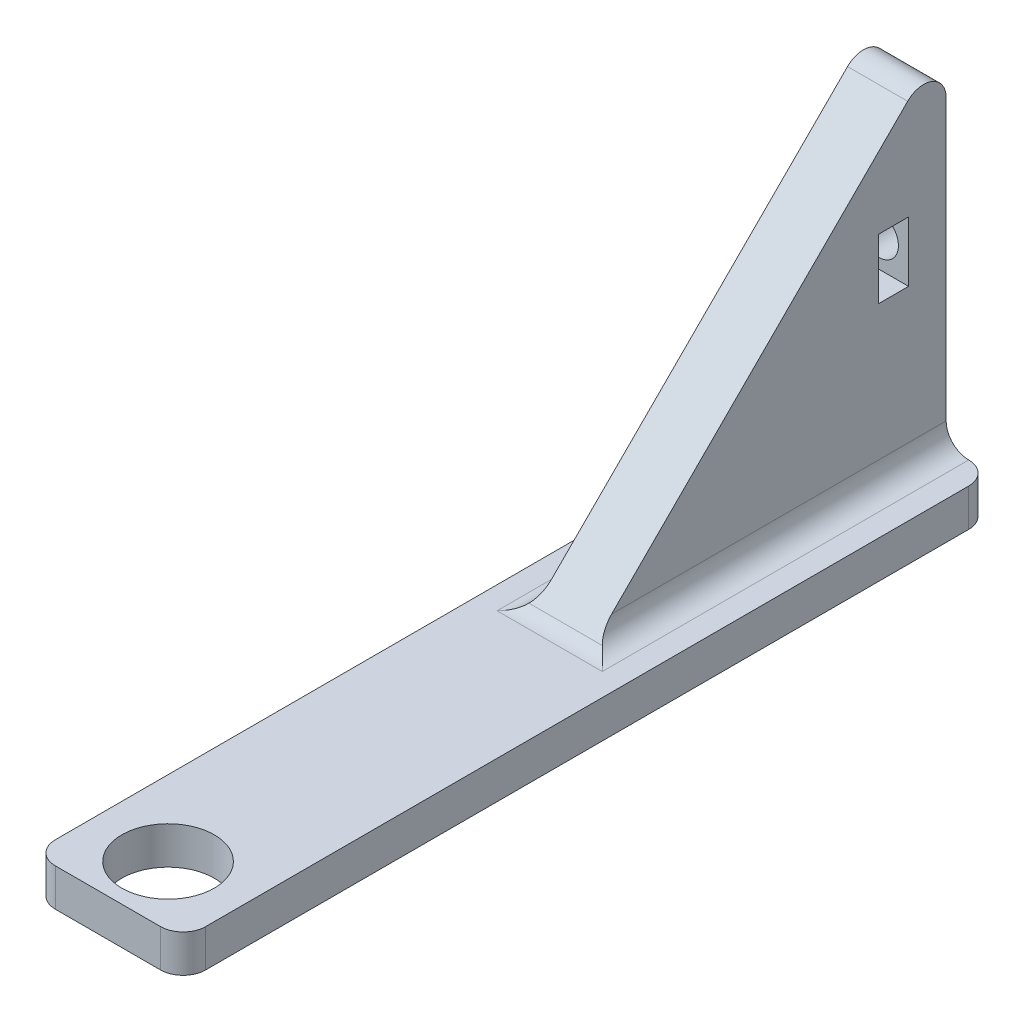
ISO-10303-21;
HEADER;
FILE_DESCRIPTION(('STEP AP214'),'2;1');
FILE_NAME('part.step','',(''),(''),'','','');
FILE_SCHEMA(('AUTOMOTIVE_DESIGN { 1 0 10303 214 1 1 1 1 }'));
ENDSEC;
DATA;
#1=APPLICATION_CONTEXT('core data for automotive mechanical design processes');
#2=APPLICATION_PROTOCOL_DEFINITION('international standard','automotive_design',2000,#1);
#3=PRODUCT_CONTEXT('',#1,'mechanical');
#4=PRODUCT('Part','Part','',(#3));
#5=PRODUCT_RELATED_PRODUCT_CATEGORY('part','',(#4));
#6=PRODUCT_DEFINITION_FORMATION('','',#4);
#7=PRODUCT_DEFINITION_CONTEXT('part definition',#1,'design');
#8=PRODUCT_DEFINITION('design','',#6,#7);
#9=PRODUCT_DEFINITION_SHAPE('','',#8);
#10=(LENGTH_UNIT() NAMED_UNIT(*) SI_UNIT(.MILLI.,.METRE.));
#11=(NAMED_UNIT(*) PLANE_ANGLE_UNIT() SI_UNIT($,.RADIAN.));
#12=(NAMED_UNIT(*) SI_UNIT($,.STERADIAN.) SOLID_ANGLE_UNIT());
#13=UNCERTAINTY_MEASURE_WITH_UNIT(LENGTH_MEASURE(1.E-05),#10,'distance_accuracy_value','');
#14=(GEOMETRIC_REPRESENTATION_CONTEXT(3) GLOBAL_UNCERTAINTY_ASSIGNED_CONTEXT((#13)) GLOBAL_UNIT_ASSIGNED_CONTEXT((#10,
#11,#12)) REPRESENTATION_CONTEXT('',''));
#15=CARTESIAN_POINT('',(0.,0.,0.));
#16=DIRECTION('',(0.,0.,1.));
#17=DIRECTION('',(1.,0.,0.));
#18=AXIS2_PLACEMENT_3D('',#15,#16,#17);
#19=CARTESIAN_POINT('',(0.,5.,0.));
#20=DIRECTION('',(0.,1.,0.));
#21=DIRECTION('',(0.,0.,1.));
#22=AXIS2_PLACEMENT_3D('',#19,#20,#21);
#23=PLANE('',#22);
#24=DIRECTION('',(1.,0.,0.));
#25=VECTOR('',#24,1.);
#26=CARTESIAN_POINT('',(0.,5.,107.5));
#27=LINE('',#26,#25);
#28=CARTESIAN_POINT('',(3.,5.,107.5));
#29=VERTEX_POINT('',#28);
#30=CARTESIAN_POINT('',(17.,5.,107.5));
#31=VERTEX_POINT('',#30);
#32=EDGE_CURVE('E238',#29,#31,#27,.T.);
#33=ORIENTED_EDGE('',*,*,#32,.T.);
#34=CARTESIAN_POINT('',(17.,5.,104.5));
#35=DIRECTION('',(0.,1.,0.));
#36=DIRECTION('',(0.,0.,1.));
#37=AXIS2_PLACEMENT_3D('',#34,#35,#36);
#38=CIRCLE('',#37,3.);
#39=CARTESIAN_POINT('',(20.,5.,104.5));
#40=VERTEX_POINT('',#39);
#41=EDGE_CURVE('E306',#31,#40,#38,.T.);
#42=ORIENTED_EDGE('',*,*,#41,.T.);
#43=DIRECTION('',(0.,0.,-1.));
#44=VECTOR('',#43,1.);
#45=CARTESIAN_POINT('',(20.,5.,0.));
#46=LINE('',#45,#44);
#47=CARTESIAN_POINT('',(20.,5.,3.));
#48=VERTEX_POINT('',#47);
#49=EDGE_CURVE('E245',#40,#48,#46,.T.);
#50=ORIENTED_EDGE('',*,*,#49,.T.);
#51=CARTESIAN_POINT('',(17.,5.,3.));
#52=DIRECTION('',(0.,1.,0.));
#53=DIRECTION('',(0.,0.,1.));
#54=AXIS2_PLACEMENT_3D('',#51,#52,#53);
#55=CIRCLE('',#54,3.);
#56=CARTESIAN_POINT('',(17.,5.,0.));
#57=VERTEX_POINT('',#56);
#58=EDGE_CURVE('E301',#48,#57,#55,.T.);
#59=ORIENTED_EDGE('',*,*,#58,.T.);
#60=DIRECTION('',(0.,0.,-1.));
#61=VECTOR('',#60,1.);
#62=CARTESIAN_POINT('',(17.,5.,47.5));
#63=LINE('',#62,#61);
#64=CARTESIAN_POINT('',(17.,5.,48.7426406871193));
#65=VERTEX_POINT('',#64);
#66=EDGE_CURVE('E292',#57,#65,#63,.F.);
#67=ORIENTED_EDGE('',*,*,#66,.T.);
#68=DIRECTION('',(1.,0.,0.));
#69=VECTOR('',#68,1.);
#70=CARTESIAN_POINT('',(6.,5.,48.7426406871193));
#71=LINE('',#70,#69);
#72=CARTESIAN_POINT('',(3.,5.,48.7426406871193));
#73=VERTEX_POINT('',#72);
#74=EDGE_CURVE('E295',#65,#73,#71,.F.);
#75=ORIENTED_EDGE('',*,*,#74,.T.);
#76=DIRECTION('',(0.,0.,-1.));
#77=VECTOR('',#76,1.);
#78=CARTESIAN_POINT('',(3.,5.,0.));
#79=LINE('',#78,#77);
#80=CARTESIAN_POINT('',(3.,5.,0.));
#81=VERTEX_POINT('',#80);
#82=EDGE_CURVE('E298',#73,#81,#79,.T.);
#83=ORIENTED_EDGE('',*,*,#82,.T.);
#84=CARTESIAN_POINT('',(3.,5.,3.));
#85=DIRECTION('',(0.,1.,0.));
#86=DIRECTION('',(0.,0.,1.));
#87=AXIS2_PLACEMENT_3D('',#84,#85,#86);
#88=CIRCLE('',#87,3.);
#89=CARTESIAN_POINT('',(0.,5.,3.));
#90=VERTEX_POINT('',#89);
#91=EDGE_CURVE('E299',#81,#90,#88,.T.);
#92=ORIENTED_EDGE('',*,*,#91,.T.);
#93=DIRECTION('',(0.,0.,1.));
#94=VECTOR('',#93,1.);
#95=CARTESIAN_POINT('',(0.,5.,0.));
#96=LINE('',#95,#94);
#97=CARTESIAN_POINT('',(0.,5.,104.5));
#98=VERTEX_POINT('',#97);
#99=EDGE_CURVE('E232',#90,#98,#96,.T.);
#100=ORIENTED_EDGE('',*,*,#99,.T.);
#101=CARTESIAN_POINT('',(3.,5.,104.5));
#102=DIRECTION('',(0.,1.,0.));
#103=DIRECTION('',(0.,0.,1.));
#104=AXIS2_PLACEMENT_3D('',#101,#102,#103);
#105=CIRCLE('',#104,3.);
#106=EDGE_CURVE('E302',#98,#29,#105,.T.);
#107=ORIENTED_EDGE('',*,*,#106,.T.);
#108=EDGE_LOOP('',(#33,#42,#50,#59,#67,#75,#83,#92,#100,#107));
#109=FACE_BOUND('',#108,.T.);
#110=CARTESIAN_POINT('',(10.,5.,99.5));
#111=DIRECTION('',(0.,1.,0.));
#112=DIRECTION('',(0.,0.,1.));
#113=AXIS2_PLACEMENT_3D('',#110,#111,#112);
#114=CIRCLE('',#113,6.15000000000001);
#115=CARTESIAN_POINT('',(10.,5.,105.65));
#116=VERTEX_POINT('',#115);
#117=EDGE_CURVE('E230',#116,#116,#114,.T.);
#118=ORIENTED_EDGE('',*,*,#117,.F.);
#119=EDGE_LOOP('',(#118));
#120=FACE_BOUND('',#119,.T.);
#121=ADVANCED_FACE('F39',(#109,#120),#23,.T.);
#122=CARTESIAN_POINT('',(0.,0.,0.));
#123=DIRECTION('',(0.,1.,0.));
#124=DIRECTION('',(0.,0.,1.));
#125=AXIS2_PLACEMENT_3D('',#122,#123,#124);
#126=PLANE('',#125);
#127=DIRECTION('',(-1.,0.,0.));
#128=VECTOR('',#127,1.);
#129=CARTESIAN_POINT('',(0.,0.,0.));
#130=LINE('',#129,#128);
#131=CARTESIAN_POINT('',(17.,0.,0.));
#132=VERTEX_POINT('',#131);
#133=CARTESIAN_POINT('',(3.,0.,0.));
#134=VERTEX_POINT('',#133);
#135=EDGE_CURVE('E237',#132,#134,#130,.T.);
#136=ORIENTED_EDGE('',*,*,#135,.F.);
#137=CARTESIAN_POINT('',(17.,0.,3.));
#138=DIRECTION('',(0.,1.,0.));
#139=DIRECTION('',(0.,0.,1.));
#140=AXIS2_PLACEMENT_3D('',#137,#138,#139);
#141=CIRCLE('',#140,3.);
#142=CARTESIAN_POINT('',(20.,0.,3.));
#143=VERTEX_POINT('',#142);
#144=EDGE_CURVE('E284',#132,#143,#141,.F.);
#145=ORIENTED_EDGE('',*,*,#144,.T.);
#146=DIRECTION('',(0.,0.,-1.));
#147=VECTOR('',#146,1.);
#148=CARTESIAN_POINT('',(20.,0.,0.));
#149=LINE('',#148,#147);
#150=CARTESIAN_POINT('',(20.,0.,104.5));
#151=VERTEX_POINT('',#150);
#152=EDGE_CURVE('E252',#151,#143,#149,.T.);
#153=ORIENTED_EDGE('',*,*,#152,.F.);
#154=CARTESIAN_POINT('',(17.,0.,104.5));
#155=DIRECTION('',(0.,1.,0.));
#156=DIRECTION('',(0.,0.,1.));
#157=AXIS2_PLACEMENT_3D('',#154,#155,#156);
#158=CIRCLE('',#157,3.);
#159=CARTESIAN_POINT('',(17.,0.,107.5));
#160=VERTEX_POINT('',#159);
#161=EDGE_CURVE('E281',#151,#160,#158,.F.);
#162=ORIENTED_EDGE('',*,*,#161,.T.);
#163=DIRECTION('',(1.,0.,0.));
#164=VECTOR('',#163,1.);
#165=CARTESIAN_POINT('',(0.,0.,107.5));
#166=LINE('',#165,#164);
#167=CARTESIAN_POINT('',(3.,0.,107.5));
#168=VERTEX_POINT('',#167);
#169=EDGE_CURVE('E247',#168,#160,#166,.T.);
#170=ORIENTED_EDGE('',*,*,#169,.F.);
#171=CARTESIAN_POINT('',(3.,0.,104.5));
#172=DIRECTION('',(0.,1.,0.));
#173=DIRECTION('',(0.,0.,1.));
#174=AXIS2_PLACEMENT_3D('',#171,#172,#173);
#175=CIRCLE('',#174,3.);
#176=CARTESIAN_POINT('',(0.,0.,104.5));
#177=VERTEX_POINT('',#176);
#178=EDGE_CURVE('E276',#168,#177,#175,.F.);
#179=ORIENTED_EDGE('',*,*,#178,.T.);
#180=DIRECTION('',(0.,0.,1.));
#181=VECTOR('',#180,1.);
#182=CARTESIAN_POINT('',(0.,0.,0.));
#183=LINE('',#182,#181);
#184=CARTESIAN_POINT('',(0.,0.,3.));
#185=VERTEX_POINT('',#184);
#186=EDGE_CURVE('E235',#185,#177,#183,.T.);
#187=ORIENTED_EDGE('',*,*,#186,.F.);
#188=CARTESIAN_POINT('',(3.,0.,3.));
#189=DIRECTION('',(0.,1.,0.));
#190=DIRECTION('',(0.,0.,1.));
#191=AXIS2_PLACEMENT_3D('',#188,#189,#190);
#192=CIRCLE('',#191,3.);
#193=EDGE_CURVE('E282',#185,#134,#192,.F.);
#194=ORIENTED_EDGE('',*,*,#193,.T.);
#195=EDGE_LOOP('',(#136,#145,#153,#162,#170,#179,#187,#194));
#196=FACE_BOUND('',#195,.T.);
#197=CARTESIAN_POINT('',(10.,0.,99.5));
#198=DIRECTION('',(0.,1.,0.));
#199=DIRECTION('',(0.,0.,1.));
#200=AXIS2_PLACEMENT_3D('',#197,#198,#199);
#201=CIRCLE('',#200,6.15000000000001);
#202=CARTESIAN_POINT('',(10.,0.,105.65));
#203=VERTEX_POINT('',#202);
#204=EDGE_CURVE('E226',#203,#203,#201,.T.);
#205=ORIENTED_EDGE('',*,*,#204,.T.);
#206=EDGE_LOOP('',(#205));
#207=FACE_BOUND('',#206,.T.);
#208=ADVANCED_FACE('F370',(#196,#207),#126,.F.);
#209=CARTESIAN_POINT('',(0.,5.,0.));
#210=DIRECTION('',(1.,0.,0.));
#211=DIRECTION('',(0.,0.,-1.));
#212=AXIS2_PLACEMENT_3D('',#209,#210,#211);
#213=PLANE('',#212);
#214=ORIENTED_EDGE('',*,*,#99,.F.);
#215=DIRECTION('',(0.,-1.,0.));
#216=VECTOR('',#215,1.);
#217=CARTESIAN_POINT('',(0.,5.,3.));
#218=LINE('',#217,#216);
#219=EDGE_CURVE('E309',#90,#185,#218,.T.);
#220=ORIENTED_EDGE('',*,*,#219,.T.);
#221=ORIENTED_EDGE('',*,*,#186,.T.);
#222=DIRECTION('',(0.,-1.,0.));
#223=VECTOR('',#222,1.);
#224=CARTESIAN_POINT('',(0.,5.,104.5));
#225=LINE('',#224,#223);
#226=EDGE_CURVE('E308',#177,#98,#225,.F.);
#227=ORIENTED_EDGE('',*,*,#226,.T.);
#228=EDGE_LOOP('',(#214,#220,#221,#227));
#229=FACE_BOUND('',#228,.T.);
#230=ADVANCED_FACE('F389',(#229),#213,.F.);
#231=CARTESIAN_POINT('',(0.,5.,107.5));
#232=DIRECTION('',(0.,0.,-1.));
#233=DIRECTION('',(-1.,0.,0.));
#234=AXIS2_PLACEMENT_3D('',#231,#232,#233);
#235=PLANE('',#234);
#236=ORIENTED_EDGE('',*,*,#169,.T.);
#237=DIRECTION('',(0.,-1.,0.));
#238=VECTOR('',#237,1.);
#239=CARTESIAN_POINT('',(17.,5.,107.5));
#240=LINE('',#239,#238);
#241=EDGE_CURVE('E317',#160,#31,#240,.F.);
#242=ORIENTED_EDGE('',*,*,#241,.T.);
#243=ORIENTED_EDGE('',*,*,#32,.F.);
#244=DIRECTION('',(0.,-1.,0.));
#245=VECTOR('',#244,1.);
#246=CARTESIAN_POINT('',(3.,5.,107.5));
#247=LINE('',#246,#245);
#248=EDGE_CURVE('E312',#29,#168,#247,.T.);
#249=ORIENTED_EDGE('',*,*,#248,.T.);
#250=EDGE_LOOP('',(#236,#242,#243,#249));
#251=FACE_BOUND('',#250,.T.);
#252=ADVANCED_FACE('F377',(#251),#235,.F.);
#253=CARTESIAN_POINT('',(20.,5.,0.));
#254=DIRECTION('',(-1.,0.,0.));
#255=DIRECTION('',(0.,0.,1.));
#256=AXIS2_PLACEMENT_3D('',#253,#254,#255);
#257=PLANE('',#256);
#258=ORIENTED_EDGE('',*,*,#152,.T.);
#259=DIRECTION('',(0.,-1.,0.));
#260=VECTOR('',#259,1.);
#261=CARTESIAN_POINT('',(20.,5.,3.));
#262=LINE('',#261,#260);
#263=EDGE_CURVE('E290',#143,#48,#262,.F.);
#264=ORIENTED_EDGE('',*,*,#263,.T.);
#265=ORIENTED_EDGE('',*,*,#49,.F.);
#266=DIRECTION('',(0.,-1.,0.));
#267=VECTOR('',#266,1.);
#268=CARTESIAN_POINT('',(20.,5.,104.5));
#269=LINE('',#268,#267);
#270=EDGE_CURVE('E287',#40,#151,#269,.T.);
#271=ORIENTED_EDGE('',*,*,#270,.T.);
#272=EDGE_LOOP('',(#258,#264,#265,#271));
#273=FACE_BOUND('',#272,.T.);
#274=ADVANCED_FACE('F369',(#273),#257,.F.);
#275=CARTESIAN_POINT('',(0.,5.,0.));
#276=DIRECTION('',(0.,0.,1.));
#277=DIRECTION('',(1.,0.,0.));
#278=AXIS2_PLACEMENT_3D('',#275,#276,#277);
#279=PLANE('',#278);
#280=CARTESIAN_POINT('',(10.,30.,0.));
#281=DIRECTION('',(0.,0.,-1.));
#282=DIRECTION('',(-1.,0.,0.));
#283=AXIS2_PLACEMENT_3D('',#280,#281,#282);
#284=CIRCLE('',#283,2.65);
#285=CARTESIAN_POINT('',(7.35,30.,0.));
#286=VERTEX_POINT('',#285);
#287=EDGE_CURVE('E208',#286,#286,#284,.T.);
#288=ORIENTED_EDGE('',*,*,#287,.F.);
#289=EDGE_LOOP('',(#288));
#290=FACE_BOUND('',#289,.T.);
#291=DIRECTION('',(0.,1.,0.));
#292=VECTOR('',#291,1.);
#293=CARTESIAN_POINT('',(6.,5.,0.));
#294=LINE('',#293,#292);
#295=CARTESIAN_POINT('',(6.,8.,0.));
#296=VERTEX_POINT('',#295);
#297=CARTESIAN_POINT('',(6.,45.2573593128807,0.));
#298=VERTEX_POINT('',#297);
#299=EDGE_CURVE('E222',#296,#298,#294,.T.);
#300=ORIENTED_EDGE('',*,*,#299,.T.);
#301=DIRECTION('',(1.,0.,0.));
#302=VECTOR('',#301,1.);
#303=CARTESIAN_POINT('',(14.,45.2573593128807,0.));
#304=LINE('',#303,#302);
#305=CARTESIAN_POINT('',(14.,45.2573593128807,0.));
#306=VERTEX_POINT('',#305);
#307=EDGE_CURVE('E264',#298,#306,#304,.T.);
#308=ORIENTED_EDGE('',*,*,#307,.T.);
#309=DIRECTION('',(0.,1.,0.));
#310=VECTOR('',#309,1.);
#311=CARTESIAN_POINT('',(14.,5.,0.));
#312=LINE('',#311,#310);
#313=CARTESIAN_POINT('',(14.,8.,0.));
#314=VERTEX_POINT('',#313);
#315=EDGE_CURVE('E211',#314,#306,#312,.T.);
#316=ORIENTED_EDGE('',*,*,#315,.F.);
#317=CARTESIAN_POINT('',(17.,8.,0.));
#318=DIRECTION('',(0.,0.,1.));
#319=DIRECTION('',(1.,0.,0.));
#320=AXIS2_PLACEMENT_3D('',#317,#318,#319);
#321=CIRCLE('',#320,3.);
#322=EDGE_CURVE('E48',#314,#57,#321,.T.);
#323=ORIENTED_EDGE('',*,*,#322,.T.);
#324=DIRECTION('',(0.,-1.,0.));
#325=VECTOR('',#324,1.);
#326=CARTESIAN_POINT('',(17.,5.,0.));
#327=LINE('',#326,#325);
#328=EDGE_CURVE('E265',#57,#132,#327,.T.);
#329=ORIENTED_EDGE('',*,*,#328,.T.);
#330=ORIENTED_EDGE('',*,*,#135,.T.);
#331=DIRECTION('',(0.,-1.,0.));
#332=VECTOR('',#331,1.);
#333=CARTESIAN_POINT('',(3.,5.,0.));
#334=LINE('',#333,#332);
#335=EDGE_CURVE('E244',#134,#81,#334,.F.);
#336=ORIENTED_EDGE('',*,*,#335,.T.);
#337=CARTESIAN_POINT('',(3.,8.,0.));
#338=DIRECTION('',(0.,0.,1.));
#339=DIRECTION('',(1.,0.,0.));
#340=AXIS2_PLACEMENT_3D('',#337,#338,#339);
#341=CIRCLE('',#340,3.);
#342=EDGE_CURVE('E319',#81,#296,#341,.T.);
#343=ORIENTED_EDGE('',*,*,#342,.T.);
#344=EDGE_LOOP('',(#300,#308,#316,#323,#329,#330,#336,#343));
#345=FACE_BOUND('',#344,.T.);
#346=ADVANCED_FACE('F349',(#290,#345),#279,.F.);
#347=CARTESIAN_POINT('',(10.,5.,99.5));
#348=DIRECTION('',(0.,-1.,0.));
#349=DIRECTION('',(0.,0.,-1.));
#350=AXIS2_PLACEMENT_3D('',#347,#348,#349);
#351=CYLINDRICAL_SURFACE('',#350,6.15000000000001);
#352=ORIENTED_EDGE('',*,*,#117,.T.);
#353=EDGE_LOOP('',(#352));
#354=FACE_BOUND('',#353,.T.);
#355=ORIENTED_EDGE('',*,*,#204,.F.);
#356=EDGE_LOOP('',(#355));
#357=FACE_BOUND('',#356,.T.);
#358=ADVANCED_FACE('F396',(#354,#357),#351,.F.);
#359=CARTESIAN_POINT('',(6.,52.5,0.));
#360=DIRECTION('',(0.,0.707106781186547,0.707106781186547));
#361=DIRECTION('',(0.,-0.707106781186548,0.707106781186548));
#362=AXIS2_PLACEMENT_3D('',#359,#360,#361);
#363=PLANE('',#362);
#364=DIRECTION('',(0.,-0.707106781186548,0.707106781186548));
#365=VECTOR('',#364,1.);
#366=CARTESIAN_POINT('',(14.,52.5,0.));
#367=LINE('',#366,#365);
#368=CARTESIAN_POINT('',(14.,47.3786796564404,5.12132034355965));
#369=VERTEX_POINT('',#368);
#370=CARTESIAN_POINT('',(14.,7.99999999999999,44.5));
#371=VERTEX_POINT('',#370);
#372=EDGE_CURVE('E218',#369,#371,#367,.T.);
#373=ORIENTED_EDGE('',*,*,#372,.F.);
#374=DIRECTION('',(1.,0.,0.));
#375=VECTOR('',#374,1.);
#376=CARTESIAN_POINT('',(6.,47.3786796564404,5.12132034355964));
#377=LINE('',#376,#375);
#378=CARTESIAN_POINT('',(6.,47.3786796564404,5.12132034355965));
#379=VERTEX_POINT('',#378);
#380=EDGE_CURVE('E271',#369,#379,#377,.F.);
#381=ORIENTED_EDGE('',*,*,#380,.T.);
#382=DIRECTION('',(0.,-0.707106781186548,0.707106781186548));
#383=VECTOR('',#382,1.);
#384=CARTESIAN_POINT('',(6.,52.5,0.));
#385=LINE('',#384,#383);
#386=CARTESIAN_POINT('',(6.,7.99999999999999,44.5));
#387=VERTEX_POINT('',#386);
#388=EDGE_CURVE('E225',#379,#387,#385,.T.);
#389=ORIENTED_EDGE('',*,*,#388,.T.);
#390=CARTESIAN_POINT('',(3.,8.,44.5));
#391=DIRECTION('',(0.,0.707106781186547,0.707106781186547));
#392=DIRECTION('',(0.,0.707106781186548,-0.707106781186548));
#393=AXIS2_PLACEMENT_3D('',#390,#391,#392);
#394=ELLIPSE('',#393,4.24264068711929,3.);
#395=CARTESIAN_POINT('',(5.12132034355964,5.87867965644036,46.6213203435596));
#396=VERTEX_POINT('',#395);
#397=EDGE_CURVE('E318',#387,#396,#394,.F.);
#398=ORIENTED_EDGE('',*,*,#397,.T.);
#399=DIRECTION('',(1.,0.,0.));
#400=VECTOR('',#399,1.);
#401=CARTESIAN_POINT('',(14.,5.87867965644036,46.6213203435596));
#402=LINE('',#401,#400);
#403=CARTESIAN_POINT('',(14.8786796564404,5.87867965644036,46.6213203435596));
#404=VERTEX_POINT('',#403);
#405=EDGE_CURVE('E54',#396,#404,#402,.T.);
#406=ORIENTED_EDGE('',*,*,#405,.T.);
#407=CARTESIAN_POINT('',(17.,8.,44.5));
#408=DIRECTION('',(0.,0.707106781186547,0.707106781186547));
#409=DIRECTION('',(0.,-0.707106781186548,0.707106781186548));
#410=AXIS2_PLACEMENT_3D('',#407,#408,#409);
#411=ELLIPSE('',#410,4.24264068711929,3.);
#412=EDGE_CURVE('E11',#404,#371,#411,.F.);
#413=ORIENTED_EDGE('',*,*,#412,.T.);
#414=EDGE_LOOP('',(#373,#381,#389,#398,#406,#413));
#415=FACE_BOUND('',#414,.T.);
#416=ADVANCED_FACE('F336',(#415),#363,.T.);
#417=CARTESIAN_POINT('',(6.,0.,0.));
#418=DIRECTION('',(1.,0.,0.));
#419=DIRECTION('',(0.,0.,-1.));
#420=AXIS2_PLACEMENT_3D('',#417,#418,#419);
#421=PLANE('',#420);
#422=DIRECTION('',(0.,0.,1.));
#423=VECTOR('',#422,1.);
#424=CARTESIAN_POINT('',(6.,34.,0.));
#425=LINE('',#424,#423);
#426=CARTESIAN_POINT('',(6.,34.,5.));
#427=VERTEX_POINT('',#426);
#428=CARTESIAN_POINT('',(6.,34.,9.));
#429=VERTEX_POINT('',#428);
#430=EDGE_CURVE('E210',#427,#429,#425,.T.);
#431=ORIENTED_EDGE('',*,*,#430,.T.);
#432=DIRECTION('',(0.,-1.,0.));
#433=VECTOR('',#432,1.);
#434=CARTESIAN_POINT('',(6.,0.,9.));
#435=LINE('',#434,#433);
#436=CARTESIAN_POINT('',(6.,26.,9.));
#437=VERTEX_POINT('',#436);
#438=EDGE_CURVE('E202',#429,#437,#435,.T.);
#439=ORIENTED_EDGE('',*,*,#438,.T.);
#440=DIRECTION('',(0.,0.,-1.));
#441=VECTOR('',#440,1.);
#442=CARTESIAN_POINT('',(6.,26.,0.));
#443=LINE('',#442,#441);
#444=CARTESIAN_POINT('',(6.,26.,5.));
#445=VERTEX_POINT('',#444);
#446=EDGE_CURVE('E205',#437,#445,#443,.T.);
#447=ORIENTED_EDGE('',*,*,#446,.T.);
#448=DIRECTION('',(0.,1.,0.));
#449=VECTOR('',#448,1.);
#450=CARTESIAN_POINT('',(6.,0.,5.));
#451=LINE('',#450,#449);
#452=EDGE_CURVE('E175',#445,#427,#451,.T.);
#453=ORIENTED_EDGE('',*,*,#452,.T.);
#454=EDGE_LOOP('',(#431,#439,#447,#453));
#455=FACE_BOUND('',#454,.T.);
#456=ORIENTED_EDGE('',*,*,#388,.F.);
#457=CARTESIAN_POINT('',(6.,45.2573593128807,3.));
#458=DIRECTION('',(1.,0.,0.));
#459=DIRECTION('',(0.,0.,-1.));
#460=AXIS2_PLACEMENT_3D('',#457,#458,#459);
#461=CIRCLE('',#460,3.);
#462=EDGE_CURVE('E280',#379,#298,#461,.F.);
#463=ORIENTED_EDGE('',*,*,#462,.T.);
#464=ORIENTED_EDGE('',*,*,#299,.F.);
#465=DIRECTION('',(0.,0.,-1.));
#466=VECTOR('',#465,1.);
#467=CARTESIAN_POINT('',(6.,8.,0.));
#468=LINE('',#467,#466);
#469=EDGE_CURVE('E273',#296,#387,#468,.F.);
#470=ORIENTED_EDGE('',*,*,#469,.T.);
#471=EDGE_LOOP('',(#456,#463,#464,#470));
#472=FACE_BOUND('',#471,.T.);
#473=ADVANCED_FACE('F335',(#455,#472),#421,.F.);
#474=CARTESIAN_POINT('',(14.,0.,0.));
#475=DIRECTION('',(1.,0.,0.));
#476=DIRECTION('',(0.,0.,-1.));
#477=AXIS2_PLACEMENT_3D('',#474,#475,#476);
#478=PLANE('',#477);
#479=DIRECTION('',(0.,-1.,0.));
#480=VECTOR('',#479,1.);
#481=CARTESIAN_POINT('',(14.,26.,9.));
#482=LINE('',#481,#480);
#483=CARTESIAN_POINT('',(14.,34.,9.));
#484=VERTEX_POINT('',#483);
#485=CARTESIAN_POINT('',(14.,26.,9.));
#486=VERTEX_POINT('',#485);
#487=EDGE_CURVE('E184',#484,#486,#482,.T.);
#488=ORIENTED_EDGE('',*,*,#487,.F.);
#489=DIRECTION('',(0.,0.,1.));
#490=VECTOR('',#489,1.);
#491=CARTESIAN_POINT('',(14.,34.,9.));
#492=LINE('',#491,#490);
#493=CARTESIAN_POINT('',(14.,34.,5.));
#494=VERTEX_POINT('',#493);
#495=EDGE_CURVE('E188',#494,#484,#492,.T.);
#496=ORIENTED_EDGE('',*,*,#495,.F.);
#497=DIRECTION('',(0.,1.,0.));
#498=VECTOR('',#497,1.);
#499=CARTESIAN_POINT('',(14.,26.,5.));
#500=LINE('',#499,#498);
#501=CARTESIAN_POINT('',(14.,26.,5.));
#502=VERTEX_POINT('',#501);
#503=EDGE_CURVE('E169',#502,#494,#500,.T.);
#504=ORIENTED_EDGE('',*,*,#503,.F.);
#505=DIRECTION('',(0.,0.,-1.));
#506=VECTOR('',#505,1.);
#507=CARTESIAN_POINT('',(14.,26.,9.));
#508=LINE('',#507,#506);
#509=EDGE_CURVE('E179',#486,#502,#508,.T.);
#510=ORIENTED_EDGE('',*,*,#509,.F.);
#511=EDGE_LOOP('',(#488,#496,#504,#510));
#512=FACE_BOUND('',#511,.T.);
#513=ORIENTED_EDGE('',*,*,#315,.T.);
#514=CARTESIAN_POINT('',(14.,45.2573593128807,3.));
#515=DIRECTION('',(1.,0.,0.));
#516=DIRECTION('',(0.,0.,-1.));
#517=AXIS2_PLACEMENT_3D('',#514,#515,#516);
#518=CIRCLE('',#517,3.);
#519=EDGE_CURVE('E270',#306,#369,#518,.T.);
#520=ORIENTED_EDGE('',*,*,#519,.T.);
#521=ORIENTED_EDGE('',*,*,#372,.T.);
#522=DIRECTION('',(0.,0.,-1.));
#523=VECTOR('',#522,1.);
#524=CARTESIAN_POINT('',(14.,8.,0.));
#525=LINE('',#524,#523);
#526=EDGE_CURVE('E269',#371,#314,#525,.T.);
#527=ORIENTED_EDGE('',*,*,#526,.T.);
#528=EDGE_LOOP('',(#513,#520,#521,#527));
#529=FACE_BOUND('',#528,.T.);
#530=ADVANCED_FACE('F190',(#512,#529),#478,.T.);
#531=CARTESIAN_POINT('',(10.,30.,12.));
#532=DIRECTION('',(0.,0.,-1.));
#533=DIRECTION('',(-1.,0.,0.));
#534=AXIS2_PLACEMENT_3D('',#531,#532,#533);
#535=CYLINDRICAL_SURFACE('',#534,2.65);
#536=CARTESIAN_POINT('',(10.,30.,5.));
#537=DIRECTION('',(0.,0.,-1.));
#538=DIRECTION('',(0.,1.,0.));
#539=AXIS2_PLACEMENT_3D('',#536,#537,#538);
#540=CIRCLE('',#539,2.65);
#541=CARTESIAN_POINT('',(10.,32.65,5.));
#542=VERTEX_POINT('',#541);
#543=EDGE_CURVE('E200',#542,#542,#540,.F.);
#544=ORIENTED_EDGE('',*,*,#543,.T.);
#545=EDGE_LOOP('',(#544));
#546=FACE_BOUND('',#545,.T.);
#547=ORIENTED_EDGE('',*,*,#287,.T.);
#548=EDGE_LOOP('',(#547));
#549=FACE_BOUND('',#548,.T.);
#550=ADVANCED_FACE('F472',(#546,#549),#535,.F.);
#551=CARTESIAN_POINT('',(0.,34.,9.));
#552=DIRECTION('',(0.,1.,0.));
#553=DIRECTION('',(0.,0.,1.));
#554=AXIS2_PLACEMENT_3D('',#551,#552,#553);
#555=PLANE('',#554);
#556=DIRECTION('',(1.,0.,0.));
#557=VECTOR('',#556,1.);
#558=CARTESIAN_POINT('',(0.,34.,5.));
#559=LINE('',#558,#557);
#560=EDGE_CURVE('E174',#427,#494,#559,.T.);
#561=ORIENTED_EDGE('',*,*,#560,.T.);
#562=ORIENTED_EDGE('',*,*,#495,.T.);
#563=DIRECTION('',(1.,0.,0.));
#564=VECTOR('',#563,1.);
#565=CARTESIAN_POINT('',(0.,34.,9.));
#566=LINE('',#565,#564);
#567=EDGE_CURVE('E193',#429,#484,#566,.T.);
#568=ORIENTED_EDGE('',*,*,#567,.F.);
#569=ORIENTED_EDGE('',*,*,#430,.F.);
#570=EDGE_LOOP('',(#561,#562,#568,#569));
#571=FACE_BOUND('',#570,.T.);
#572=ADVANCED_FACE('F334',(#571),#555,.F.);
#573=CARTESIAN_POINT('',(0.,26.,9.));
#574=DIRECTION('',(0.,-1.,0.));
#575=DIRECTION('',(0.,0.,-1.));
#576=AXIS2_PLACEMENT_3D('',#573,#574,#575);
#577=PLANE('',#576);
#578=DIRECTION('',(1.,0.,0.));
#579=VECTOR('',#578,1.);
#580=CARTESIAN_POINT('',(0.,26.,9.));
#581=LINE('',#580,#579);
#582=EDGE_CURVE('E176',#437,#486,#581,.T.);
#583=ORIENTED_EDGE('',*,*,#582,.T.);
#584=ORIENTED_EDGE('',*,*,#509,.T.);
#585=DIRECTION('',(1.,0.,0.));
#586=VECTOR('',#585,1.);
#587=CARTESIAN_POINT('',(0.,26.,5.));
#588=LINE('',#587,#586);
#589=EDGE_CURVE('E165',#445,#502,#588,.T.);
#590=ORIENTED_EDGE('',*,*,#589,.F.);
#591=ORIENTED_EDGE('',*,*,#446,.F.);
#592=EDGE_LOOP('',(#583,#584,#590,#591));
#593=FACE_BOUND('',#592,.T.);
#594=ADVANCED_FACE('F181',(#593),#577,.F.);
#595=CARTESIAN_POINT('',(0.,26.,9.));
#596=DIRECTION('',(0.,0.,1.));
#597=DIRECTION('',(1.,0.,0.));
#598=AXIS2_PLACEMENT_3D('',#595,#596,#597);
#599=PLANE('',#598);
#600=CARTESIAN_POINT('',(10.,30.,9.));
#601=DIRECTION('',(0.,0.,1.));
#602=DIRECTION('',(1.,0.,0.));
#603=AXIS2_PLACEMENT_3D('',#600,#601,#602);
#604=CIRCLE('',#603,2.65);
#605=CARTESIAN_POINT('',(12.65,30.,9.));
#606=VERTEX_POINT('',#605);
#607=EDGE_CURVE('E201',#606,#606,#604,.F.);
#608=ORIENTED_EDGE('',*,*,#607,.F.);
#609=EDGE_LOOP('',(#608));
#610=FACE_BOUND('',#609,.T.);
#611=ORIENTED_EDGE('',*,*,#567,.T.);
#612=ORIENTED_EDGE('',*,*,#487,.T.);
#613=ORIENTED_EDGE('',*,*,#582,.F.);
#614=ORIENTED_EDGE('',*,*,#438,.F.);
#615=EDGE_LOOP('',(#611,#612,#613,#614));
#616=FACE_BOUND('',#615,.T.);
#617=ADVANCED_FACE('F329',(#610,#616),#599,.F.);
#618=CARTESIAN_POINT('',(0.,26.,5.));
#619=DIRECTION('',(0.,0.,-1.));
#620=DIRECTION('',(0.,1.,0.));
#621=AXIS2_PLACEMENT_3D('',#618,#619,#620);
#622=PLANE('',#621);
#623=ORIENTED_EDGE('',*,*,#543,.F.);
#624=EDGE_LOOP('',(#623));
#625=FACE_BOUND('',#624,.T.);
#626=ORIENTED_EDGE('',*,*,#589,.T.);
#627=ORIENTED_EDGE('',*,*,#503,.T.);
#628=ORIENTED_EDGE('',*,*,#560,.F.);
#629=ORIENTED_EDGE('',*,*,#452,.F.);
#630=EDGE_LOOP('',(#626,#627,#628,#629));
#631=FACE_BOUND('',#630,.T.);
#632=ADVANCED_FACE('F168',(#625,#631),#622,.F.);
#633=CARTESIAN_POINT('',(10.,30.,12.));
#634=DIRECTION('',(0.,0.,-1.));
#635=DIRECTION('',(-1.,0.,0.));
#636=AXIS2_PLACEMENT_3D('',#633,#634,#635);
#637=PLANE('',#636);
#638=CARTESIAN_POINT('',(10.,30.,12.));
#639=DIRECTION('',(0.,0.,-1.));
#640=DIRECTION('',(-1.,0.,0.));
#641=AXIS2_PLACEMENT_3D('',#638,#639,#640);
#642=CIRCLE('',#641,2.65);
#643=CARTESIAN_POINT('',(7.35,30.,12.));
#644=VERTEX_POINT('',#643);
#645=EDGE_CURVE('E212',#644,#644,#642,.T.);
#646=ORIENTED_EDGE('',*,*,#645,.T.);
#647=EDGE_LOOP('',(#646));
#648=FACE_BOUND('',#647,.T.);
#649=ADVANCED_FACE('F503',(#648),#637,.T.);
#650=ORIENTED_EDGE('',*,*,#607,.T.);
#651=EDGE_LOOP('',(#650));
#652=FACE_BOUND('',#651,.T.);
#653=ORIENTED_EDGE('',*,*,#645,.F.);
#654=EDGE_LOOP('',(#653));
#655=FACE_BOUND('',#654,.T.);
#656=ADVANCED_FACE('F422',(#652,#655),#535,.F.);
#657=CARTESIAN_POINT('',(0.,45.2573593128807,3.));
#658=DIRECTION('',(-1.,0.,0.));
#659=DIRECTION('',(0.,0.,1.));
#660=AXIS2_PLACEMENT_3D('',#657,#658,#659);
#661=CYLINDRICAL_SURFACE('',#660,3.);
#662=ORIENTED_EDGE('',*,*,#462,.F.);
#663=ORIENTED_EDGE('',*,*,#380,.F.);
#664=ORIENTED_EDGE('',*,*,#519,.F.);
#665=ORIENTED_EDGE('',*,*,#307,.F.);
#666=EDGE_LOOP('',(#662,#663,#664,#665));
#667=FACE_BOUND('',#666,.T.);
#668=ADVANCED_FACE('F350',(#667),#661,.T.);
#669=CARTESIAN_POINT('',(17.,5.,3.));
#670=DIRECTION('',(0.,-1.,0.));
#671=DIRECTION('',(0.,0.,-1.));
#672=AXIS2_PLACEMENT_3D('',#669,#670,#671);
#673=CYLINDRICAL_SURFACE('',#672,3.);
#674=ORIENTED_EDGE('',*,*,#58,.F.);
#675=ORIENTED_EDGE('',*,*,#263,.F.);
#676=ORIENTED_EDGE('',*,*,#144,.F.);
#677=ORIENTED_EDGE('',*,*,#328,.F.);
#678=EDGE_LOOP('',(#674,#675,#676,#677));
#679=FACE_BOUND('',#678,.T.);
#680=ADVANCED_FACE('F364',(#679),#673,.T.);
#681=CARTESIAN_POINT('',(3.,5.,3.));
#682=DIRECTION('',(0.,-1.,0.));
#683=DIRECTION('',(0.,0.,-1.));
#684=AXIS2_PLACEMENT_3D('',#681,#682,#683);
#685=CYLINDRICAL_SURFACE('',#684,3.);
#686=ORIENTED_EDGE('',*,*,#91,.F.);
#687=ORIENTED_EDGE('',*,*,#335,.F.);
#688=ORIENTED_EDGE('',*,*,#193,.F.);
#689=ORIENTED_EDGE('',*,*,#219,.F.);
#690=EDGE_LOOP('',(#686,#687,#688,#689));
#691=FACE_BOUND('',#690,.T.);
#692=ADVANCED_FACE('F395',(#691),#685,.T.);
#693=CARTESIAN_POINT('',(17.,5.,104.5));
#694=DIRECTION('',(0.,-1.,0.));
#695=DIRECTION('',(0.,0.,-1.));
#696=AXIS2_PLACEMENT_3D('',#693,#694,#695);
#697=CYLINDRICAL_SURFACE('',#696,3.);
#698=ORIENTED_EDGE('',*,*,#41,.F.);
#699=ORIENTED_EDGE('',*,*,#241,.F.);
#700=ORIENTED_EDGE('',*,*,#161,.F.);
#701=ORIENTED_EDGE('',*,*,#270,.F.);
#702=EDGE_LOOP('',(#698,#699,#700,#701));
#703=FACE_BOUND('',#702,.T.);
#704=ADVANCED_FACE('F372',(#703),#697,.T.);
#705=CARTESIAN_POINT('',(3.,5.,104.5));
#706=DIRECTION('',(0.,-1.,0.));
#707=DIRECTION('',(0.,0.,-1.));
#708=AXIS2_PLACEMENT_3D('',#705,#706,#707);
#709=CYLINDRICAL_SURFACE('',#708,3.);
#710=ORIENTED_EDGE('',*,*,#106,.F.);
#711=ORIENTED_EDGE('',*,*,#226,.F.);
#712=ORIENTED_EDGE('',*,*,#178,.F.);
#713=ORIENTED_EDGE('',*,*,#248,.F.);
#714=EDGE_LOOP('',(#710,#711,#712,#713));
#715=FACE_BOUND('',#714,.T.);
#716=ADVANCED_FACE('F384',(#715),#709,.T.);
#717=CARTESIAN_POINT('',(17.,8.,0.));
#718=DIRECTION('',(0.,0.,1.));
#719=DIRECTION('',(1.,0.,0.));
#720=AXIS2_PLACEMENT_3D('',#717,#718,#719);
#721=CYLINDRICAL_SURFACE('',#720,3.);
#722=ORIENTED_EDGE('',*,*,#526,.F.);
#723=ORIENTED_EDGE('',*,*,#412,.F.);
#724=CARTESIAN_POINT('',(17.,8.,48.7426406871193));
#725=DIRECTION('',(-0.707106781186547,0.,0.707106781186547));
#726=DIRECTION('',(0.707106781186547,0.,0.707106781186547));
#727=AXIS2_PLACEMENT_3D('',#724,#725,#726);
#728=ELLIPSE('',#727,4.24264068711928,3.);
#729=EDGE_CURVE('E43',#65,#404,#728,.F.);
#730=ORIENTED_EDGE('',*,*,#729,.F.);
#731=ORIENTED_EDGE('',*,*,#66,.F.);
#732=ORIENTED_EDGE('',*,*,#322,.F.);
#733=EDGE_LOOP('',(#722,#723,#730,#731,#732));
#734=FACE_BOUND('',#733,.T.);
#735=ADVANCED_FACE('F41',(#734),#721,.F.);
#736=CARTESIAN_POINT('',(6.,8.,48.7426406871193));
#737=DIRECTION('',(-1.,0.,0.));
#738=DIRECTION('',(0.,0.,1.));
#739=AXIS2_PLACEMENT_3D('',#736,#737,#738);
#740=CYLINDRICAL_SURFACE('',#739,3.);
#741=ORIENTED_EDGE('',*,*,#405,.F.);
#742=CARTESIAN_POINT('',(3.,8.,48.7426406871193));
#743=DIRECTION('',(-0.707106781186547,0.,-0.707106781186547));
#744=DIRECTION('',(-0.707106781186547,0.,0.707106781186547));
#745=AXIS2_PLACEMENT_3D('',#742,#743,#744);
#746=ELLIPSE('',#745,4.24264068711928,3.);
#747=EDGE_CURVE('E325',#73,#396,#746,.F.);
#748=ORIENTED_EDGE('',*,*,#747,.F.);
#749=ORIENTED_EDGE('',*,*,#74,.F.);
#750=ORIENTED_EDGE('',*,*,#729,.T.);
#751=EDGE_LOOP('',(#741,#748,#749,#750));
#752=FACE_BOUND('',#751,.T.);
#753=ADVANCED_FACE('F435',(#752),#740,.F.);
#754=CARTESIAN_POINT('',(3.,8.,0.));
#755=DIRECTION('',(0.,0.,-1.));
#756=DIRECTION('',(-1.,0.,0.));
#757=AXIS2_PLACEMENT_3D('',#754,#755,#756);
#758=CYLINDRICAL_SURFACE('',#757,3.);
#759=ORIENTED_EDGE('',*,*,#397,.F.);
#760=ORIENTED_EDGE('',*,*,#469,.F.);
#761=ORIENTED_EDGE('',*,*,#342,.F.);
#762=ORIENTED_EDGE('',*,*,#82,.F.);
#763=ORIENTED_EDGE('',*,*,#747,.T.);
#764=EDGE_LOOP('',(#759,#760,#761,#762,#763));
#765=FACE_BOUND('',#764,.T.);
#766=ADVANCED_FACE('F393',(#765),#758,.F.);
#767=CLOSED_SHELL('',(#121,#208,#230,#252,#274,#346,#358,#416,#473,#530,#550,#572,#594,#617,
#632,#649,#656,#668,#680,#692,#704,#716,#735,#753,#766));
#768=MANIFOLD_SOLID_BREP('B2',#767);
#769=ADVANCED_BREP_SHAPE_REPRESENTATION('',(#18,#768),#14);
#770=SHAPE_DEFINITION_REPRESENTATION(#9,#769);
ENDSEC;
END-ISO-10303-21;
